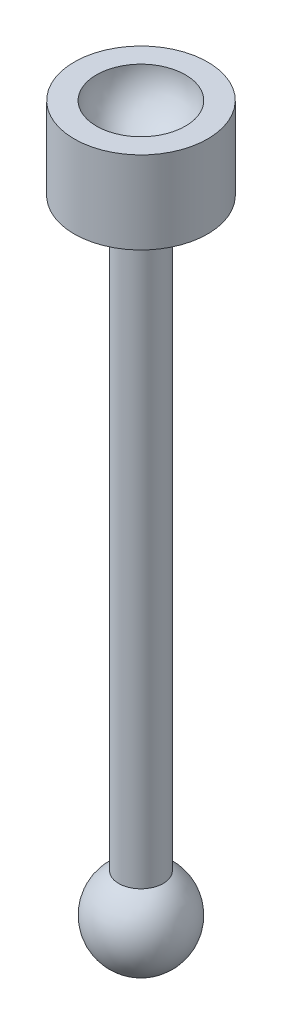
ISO-10303-21;
HEADER;
FILE_DESCRIPTION(('STEP AP214'),'2;1');
FILE_NAME('part.step','',(''),(''),'','','');
FILE_SCHEMA(('AUTOMOTIVE_DESIGN { 1 0 10303 214 1 1 1 1 }'));
ENDSEC;
DATA;
#1=APPLICATION_CONTEXT('core data for automotive mechanical design processes');
#2=APPLICATION_PROTOCOL_DEFINITION('international standard','automotive_design',2000,#1);
#3=PRODUCT_CONTEXT('',#1,'mechanical');
#4=PRODUCT('Part','Part','',(#3));
#5=PRODUCT_RELATED_PRODUCT_CATEGORY('part','',(#4));
#6=PRODUCT_DEFINITION_FORMATION('','',#4);
#7=PRODUCT_DEFINITION_CONTEXT('part definition',#1,'design');
#8=PRODUCT_DEFINITION('design','',#6,#7);
#9=PRODUCT_DEFINITION_SHAPE('','',#8);
#10=(LENGTH_UNIT() NAMED_UNIT(*) SI_UNIT(.MILLI.,.METRE.));
#11=(NAMED_UNIT(*) PLANE_ANGLE_UNIT() SI_UNIT($,.RADIAN.));
#12=(NAMED_UNIT(*) SI_UNIT($,.STERADIAN.) SOLID_ANGLE_UNIT());
#13=UNCERTAINTY_MEASURE_WITH_UNIT(LENGTH_MEASURE(1.E-05),#10,'distance_accuracy_value','');
#14=(GEOMETRIC_REPRESENTATION_CONTEXT(3) GLOBAL_UNCERTAINTY_ASSIGNED_CONTEXT((#13)) GLOBAL_UNIT_ASSIGNED_CONTEXT((#10,
#11,#12)) REPRESENTATION_CONTEXT('',''));
#15=CARTESIAN_POINT('',(0.,0.,0.));
#16=DIRECTION('',(0.,0.,1.));
#17=DIRECTION('',(1.,0.,0.));
#18=AXIS2_PLACEMENT_3D('',#15,#16,#17);
#19=CARTESIAN_POINT('',(0.,41.734293269582,0.));
#20=DIRECTION('',(0.,1.,0.));
#21=DIRECTION('',(-1.,0.,0.));
#22=AXIS2_PLACEMENT_3D('',#19,#20,#21);
#23=CYLINDRICAL_SURFACE('',#22,4.99999999999999);
#24=CARTESIAN_POINT('',(0.,-108.265706730418,0.));
#25=DIRECTION('',(0.,1.,0.));
#26=DIRECTION('',(-1.,0.,0.));
#27=AXIS2_PLACEMENT_3D('',#24,#25,#26);
#28=CIRCLE('',#27,4.99999999999998);
#29=CARTESIAN_POINT('',(-4.99999999999996,-108.265706730418,0.));
#30=VERTEX_POINT('',#29);
#31=EDGE_CURVE('E54',#30,#30,#28,.T.);
#32=ORIENTED_EDGE('',*,*,#31,.T.);
#33=EDGE_LOOP('',(#32));
#34=FACE_BOUND('',#33,.T.);
#35=CARTESIAN_POINT('',(0.,23.2139810571155,0.));
#36=DIRECTION('',(0.,1.,0.));
#37=DIRECTION('',(0.,0.,1.));
#38=AXIS2_PLACEMENT_3D('',#35,#36,#37);
#39=CIRCLE('',#38,4.99999999999999);
#40=CARTESIAN_POINT('',(0.,23.2139810571155,4.99999999999999));
#41=VERTEX_POINT('',#40);
#42=EDGE_CURVE('E10',#41,#41,#39,.T.);
#43=ORIENTED_EDGE('',*,*,#42,.F.);
#44=EDGE_LOOP('',(#43));
#45=FACE_BOUND('',#44,.T.);
#46=ADVANCED_FACE('F46',(#34,#45),#23,.T.);
#47=CARTESIAN_POINT('',(0.,-116.925960768262,0.));
#48=DIRECTION('',(0.,1.,0.));
#49=DIRECTION('',(1.,0.,0.));
#50=AXIS2_PLACEMENT_3D('',#47,#48,#49);
#51=SPHERICAL_SURFACE('',#50,10.);
#52=ORIENTED_EDGE('',*,*,#31,.F.);
#53=EDGE_LOOP('',(#52));
#54=FACE_BOUND('',#53,.T.);
#55=ADVANCED_FACE('F89',(#54),#51,.T.);
#56=CARTESIAN_POINT('',(0.,23.2139810571155,0.));
#57=DIRECTION('',(0.,1.,0.));
#58=DIRECTION('',(0.,0.,1.));
#59=AXIS2_PLACEMENT_3D('',#56,#57,#58);
#60=PLANE('',#59);
#61=ORIENTED_EDGE('',*,*,#42,.T.);
#62=EDGE_LOOP('',(#61));
#63=FACE_BOUND('',#62,.T.);
#64=CARTESIAN_POINT('',(0.,23.2139810571155,0.));
#65=DIRECTION('',(0.,1.,0.));
#66=DIRECTION('',(0.,0.,1.));
#67=AXIS2_PLACEMENT_3D('',#64,#65,#66);
#68=CIRCLE('',#67,15.);
#69=CARTESIAN_POINT('',(0.,23.2139810571155,15.));
#70=VERTEX_POINT('',#69);
#71=EDGE_CURVE('E59',#70,#70,#68,.T.);
#72=ORIENTED_EDGE('',*,*,#71,.F.);
#73=EDGE_LOOP('',(#72));
#74=FACE_BOUND('',#73,.T.);
#75=ADVANCED_FACE('F84',(#63,#74),#60,.F.);
#76=CARTESIAN_POINT('',(0.,41.734293269582,0.));
#77=DIRECTION('',(0.,1.,0.));
#78=DIRECTION('',(0.,0.,1.));
#79=AXIS2_PLACEMENT_3D('',#76,#77,#78);
#80=CYLINDRICAL_SURFACE('',#79,15.);
#81=CARTESIAN_POINT('',(0.,41.734293269582,0.));
#82=DIRECTION('',(0.,1.,0.));
#83=DIRECTION('',(0.,0.,1.));
#84=AXIS2_PLACEMENT_3D('',#81,#82,#83);
#85=CIRCLE('',#84,15.);
#86=CARTESIAN_POINT('',(0.,41.734293269582,15.));
#87=VERTEX_POINT('',#86);
#88=EDGE_CURVE('E64',#87,#87,#85,.T.);
#89=ORIENTED_EDGE('',*,*,#88,.F.);
#90=EDGE_LOOP('',(#89));
#91=FACE_BOUND('',#90,.T.);
#92=ORIENTED_EDGE('',*,*,#71,.T.);
#93=EDGE_LOOP('',(#92));
#94=FACE_BOUND('',#93,.T.);
#95=ADVANCED_FACE('F79',(#91,#94),#80,.T.);
#96=CARTESIAN_POINT('',(0.,41.734293269582,0.));
#97=DIRECTION('',(0.,-1.,0.));
#98=DIRECTION('',(1.,0.,0.));
#99=AXIS2_PLACEMENT_3D('',#96,#97,#98);
#100=PLANE('',#99);
#101=CARTESIAN_POINT('',(0.,41.734293269582,0.));
#102=DIRECTION('',(0.,1.,0.));
#103=DIRECTION('',(-1.,0.,0.));
#104=AXIS2_PLACEMENT_3D('',#101,#102,#103);
#105=CIRCLE('',#104,10.);
#106=CARTESIAN_POINT('',(-10.,41.734293269582,0.));
#107=VERTEX_POINT('',#106);
#108=EDGE_CURVE('E70',#107,#107,#105,.T.);
#109=ORIENTED_EDGE('',*,*,#108,.F.);
#110=EDGE_LOOP('',(#109));
#111=FACE_BOUND('',#110,.T.);
#112=ORIENTED_EDGE('',*,*,#88,.T.);
#113=EDGE_LOOP('',(#112));
#114=FACE_BOUND('',#113,.T.);
#115=ADVANCED_FACE('F48',(#111,#114),#100,.F.);
#116=CARTESIAN_POINT('',(0.,41.734293269582,0.));
#117=DIRECTION('',(0.,1.,0.));
#118=DIRECTION('',(1.,0.,0.));
#119=AXIS2_PLACEMENT_3D('',#116,#117,#118);
#120=SPHERICAL_SURFACE('',#119,10.);
#121=ORIENTED_EDGE('',*,*,#108,.T.);
#122=EDGE_LOOP('',(#121));
#123=FACE_BOUND('',#122,.T.);
#124=ADVANCED_FACE('F75',(#123),#120,.F.);
#125=CLOSED_SHELL('',(#46,#55,#75,#95,#115,#124));
#126=MANIFOLD_SOLID_BREP('B2',#125);
#127=ADVANCED_BREP_SHAPE_REPRESENTATION('',(#18,#126),#14);
#128=SHAPE_DEFINITION_REPRESENTATION(#9,#127);
ENDSEC;
END-ISO-10303-21;
